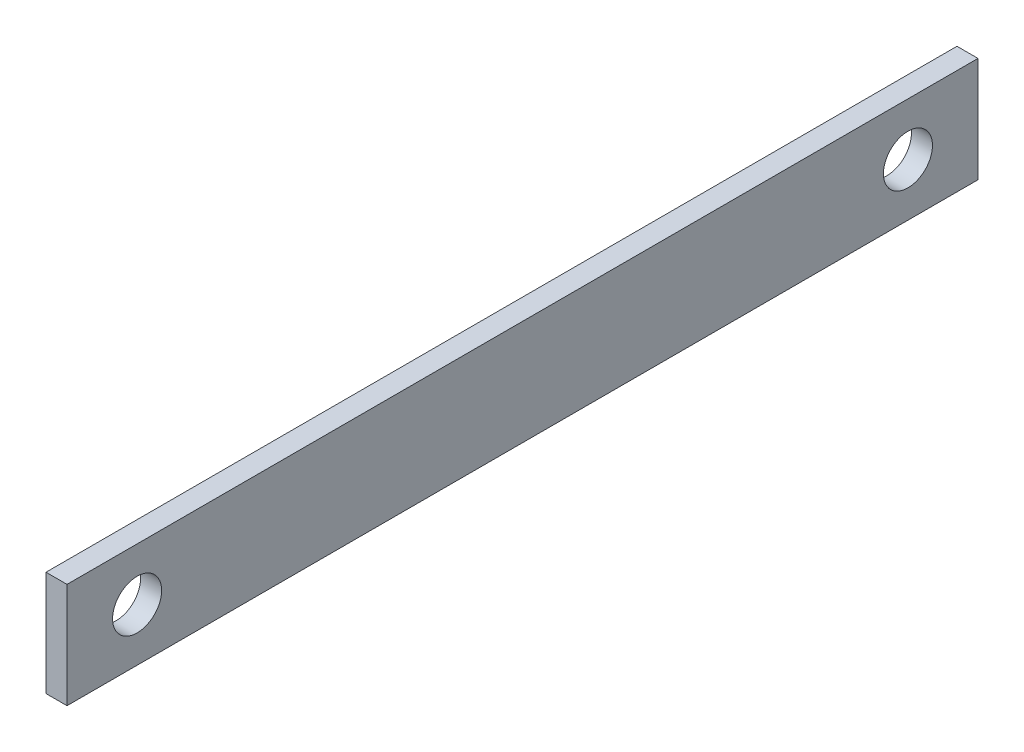
ISO-10303-21;
HEADER;
FILE_DESCRIPTION(('STEP AP214'),'2;1');
FILE_NAME('part.step','',(''),(''),'','','');
FILE_SCHEMA(('AUTOMOTIVE_DESIGN { 1 0 10303 214 1 1 1 1 }'));
ENDSEC;
DATA;
#1=APPLICATION_CONTEXT('core data for automotive mechanical design processes');
#2=APPLICATION_PROTOCOL_DEFINITION('international standard','automotive_design',2000,#1);
#3=PRODUCT_CONTEXT('',#1,'mechanical');
#4=PRODUCT('Part','Part','',(#3));
#5=PRODUCT_RELATED_PRODUCT_CATEGORY('part','',(#4));
#6=PRODUCT_DEFINITION_FORMATION('','',#4);
#7=PRODUCT_DEFINITION_CONTEXT('part definition',#1,'design');
#8=PRODUCT_DEFINITION('design','',#6,#7);
#9=PRODUCT_DEFINITION_SHAPE('','',#8);
#10=(LENGTH_UNIT() NAMED_UNIT(*) SI_UNIT(.MILLI.,.METRE.));
#11=(NAMED_UNIT(*) PLANE_ANGLE_UNIT() SI_UNIT($,.RADIAN.));
#12=(NAMED_UNIT(*) SI_UNIT($,.STERADIAN.) SOLID_ANGLE_UNIT());
#13=UNCERTAINTY_MEASURE_WITH_UNIT(LENGTH_MEASURE(1.E-05),#10,'distance_accuracy_value','');
#14=(GEOMETRIC_REPRESENTATION_CONTEXT(3) GLOBAL_UNCERTAINTY_ASSIGNED_CONTEXT((#13)) GLOBAL_UNIT_ASSIGNED_CONTEXT((#10,
#11,#12)) REPRESENTATION_CONTEXT('',''));
#15=CARTESIAN_POINT('',(0.,0.,0.));
#16=DIRECTION('',(0.,0.,1.));
#17=DIRECTION('',(1.,0.,0.));
#18=AXIS2_PLACEMENT_3D('',#15,#16,#17);
#19=CARTESIAN_POINT('',(6.,0.,0.));
#20=DIRECTION('',(-1.,0.,0.));
#21=DIRECTION('',(0.,0.,1.));
#22=AXIS2_PLACEMENT_3D('',#19,#20,#21);
#23=PLANE('',#22);
#24=DIRECTION('',(0.,1.,0.));
#25=VECTOR('',#24,1.);
#26=CARTESIAN_POINT('',(6.,-15.,-130.));
#27=LINE('',#26,#25);
#28=CARTESIAN_POINT('',(6.,-15.,-130.));
#29=VERTEX_POINT('',#28);
#30=CARTESIAN_POINT('',(6.,15.,-130.));
#31=VERTEX_POINT('',#30);
#32=EDGE_CURVE('E85',#29,#31,#27,.T.);
#33=ORIENTED_EDGE('',*,*,#32,.T.);
#34=DIRECTION('',(0.,0.,1.));
#35=VECTOR('',#34,1.);
#36=CARTESIAN_POINT('',(6.,15.,130.));
#37=LINE('',#36,#35);
#38=CARTESIAN_POINT('',(6.,15.,130.));
#39=VERTEX_POINT('',#38);
#40=EDGE_CURVE('E80',#31,#39,#37,.T.);
#41=ORIENTED_EDGE('',*,*,#40,.T.);
#42=DIRECTION('',(0.,-1.,0.));
#43=VECTOR('',#42,1.);
#44=CARTESIAN_POINT('',(6.,-15.,130.));
#45=LINE('',#44,#43);
#46=CARTESIAN_POINT('',(6.,-15.,130.));
#47=VERTEX_POINT('',#46);
#48=EDGE_CURVE('E83',#39,#47,#45,.T.);
#49=ORIENTED_EDGE('',*,*,#48,.T.);
#50=DIRECTION('',(0.,0.,-1.));
#51=VECTOR('',#50,1.);
#52=CARTESIAN_POINT('',(6.,-15.,130.));
#53=LINE('',#52,#51);
#54=EDGE_CURVE('E50',#47,#29,#53,.T.);
#55=ORIENTED_EDGE('',*,*,#54,.T.);
#56=EDGE_LOOP('',(#33,#41,#49,#55));
#57=FACE_BOUND('',#56,.T.);
#58=CARTESIAN_POINT('',(6.,0.,110.));
#59=DIRECTION('',(1.,0.,0.));
#60=DIRECTION('',(0.,0.,-1.));
#61=AXIS2_PLACEMENT_3D('',#58,#59,#60);
#62=CIRCLE('',#61,7.);
#63=CARTESIAN_POINT('',(6.,0.,103.));
#64=VERTEX_POINT('',#63);
#65=EDGE_CURVE('E100',#64,#64,#62,.T.);
#66=ORIENTED_EDGE('',*,*,#65,.F.);
#67=EDGE_LOOP('',(#66));
#68=FACE_BOUND('',#67,.T.);
#69=CARTESIAN_POINT('',(6.,0.,-110.));
#70=DIRECTION('',(1.,0.,0.));
#71=DIRECTION('',(0.,0.,-1.));
#72=AXIS2_PLACEMENT_3D('',#69,#70,#71);
#73=CIRCLE('',#72,7.);
#74=CARTESIAN_POINT('',(6.,0.,-117.));
#75=VERTEX_POINT('',#74);
#76=EDGE_CURVE('E115',#75,#75,#73,.T.);
#77=ORIENTED_EDGE('',*,*,#76,.F.);
#78=EDGE_LOOP('',(#77));
#79=FACE_BOUND('',#78,.T.);
#80=ADVANCED_FACE('F33',(#57,#68,#79),#23,.F.);
#81=CARTESIAN_POINT('',(0.,0.,0.));
#82=DIRECTION('',(-1.,0.,0.));
#83=DIRECTION('',(0.,0.,1.));
#84=AXIS2_PLACEMENT_3D('',#81,#82,#83);
#85=PLANE('',#84);
#86=CARTESIAN_POINT('',(0.,0.,110.));
#87=DIRECTION('',(1.,0.,0.));
#88=DIRECTION('',(0.,0.,-1.));
#89=AXIS2_PLACEMENT_3D('',#86,#87,#88);
#90=CIRCLE('',#89,7.);
#91=CARTESIAN_POINT('',(0.,0.,103.));
#92=VERTEX_POINT('',#91);
#93=EDGE_CURVE('E112',#92,#92,#90,.T.);
#94=ORIENTED_EDGE('',*,*,#93,.T.);
#95=EDGE_LOOP('',(#94));
#96=FACE_BOUND('',#95,.T.);
#97=DIRECTION('',(0.,1.,0.));
#98=VECTOR('',#97,1.);
#99=CARTESIAN_POINT('',(0.,-15.,-130.));
#100=LINE('',#99,#98);
#101=CARTESIAN_POINT('',(0.,-15.,-130.));
#102=VERTEX_POINT('',#101);
#103=CARTESIAN_POINT('',(0.,15.,-130.));
#104=VERTEX_POINT('',#103);
#105=EDGE_CURVE('E97',#102,#104,#100,.T.);
#106=ORIENTED_EDGE('',*,*,#105,.F.);
#107=DIRECTION('',(0.,0.,-1.));
#108=VECTOR('',#107,1.);
#109=CARTESIAN_POINT('',(0.,-15.,130.));
#110=LINE('',#109,#108);
#111=CARTESIAN_POINT('',(0.,-15.,130.));
#112=VERTEX_POINT('',#111);
#113=EDGE_CURVE('E73',#112,#102,#110,.T.);
#114=ORIENTED_EDGE('',*,*,#113,.F.);
#115=DIRECTION('',(0.,-1.,0.));
#116=VECTOR('',#115,1.);
#117=CARTESIAN_POINT('',(0.,-15.,130.));
#118=LINE('',#117,#116);
#119=CARTESIAN_POINT('',(0.,15.,130.));
#120=VERTEX_POINT('',#119);
#121=EDGE_CURVE('E67',#120,#112,#118,.T.);
#122=ORIENTED_EDGE('',*,*,#121,.F.);
#123=DIRECTION('',(0.,0.,1.));
#124=VECTOR('',#123,1.);
#125=CARTESIAN_POINT('',(0.,15.,130.));
#126=LINE('',#125,#124);
#127=EDGE_CURVE('E89',#104,#120,#126,.T.);
#128=ORIENTED_EDGE('',*,*,#127,.F.);
#129=EDGE_LOOP('',(#106,#114,#122,#128));
#130=FACE_BOUND('',#129,.T.);
#131=CARTESIAN_POINT('',(0.,0.,-110.));
#132=DIRECTION('',(1.,0.,0.));
#133=DIRECTION('',(0.,0.,-1.));
#134=AXIS2_PLACEMENT_3D('',#131,#132,#133);
#135=CIRCLE('',#134,7.);
#136=CARTESIAN_POINT('',(0.,0.,-117.));
#137=VERTEX_POINT('',#136);
#138=EDGE_CURVE('E118',#137,#137,#135,.T.);
#139=ORIENTED_EDGE('',*,*,#138,.T.);
#140=EDGE_LOOP('',(#139));
#141=FACE_BOUND('',#140,.T.);
#142=ADVANCED_FACE('F108',(#96,#130,#141),#85,.T.);
#143=CARTESIAN_POINT('',(6.,-15.,-130.));
#144=DIRECTION('',(0.,0.,1.));
#145=DIRECTION('',(1.,0.,0.));
#146=AXIS2_PLACEMENT_3D('',#143,#144,#145);
#147=PLANE('',#146);
#148=ORIENTED_EDGE('',*,*,#105,.T.);
#149=DIRECTION('',(-1.,0.,0.));
#150=VECTOR('',#149,1.);
#151=CARTESIAN_POINT('',(6.,15.,-130.));
#152=LINE('',#151,#150);
#153=EDGE_CURVE('E11',#31,#104,#152,.T.);
#154=ORIENTED_EDGE('',*,*,#153,.F.);
#155=ORIENTED_EDGE('',*,*,#32,.F.);
#156=DIRECTION('',(-1.,0.,0.));
#157=VECTOR('',#156,1.);
#158=CARTESIAN_POINT('',(6.,-15.,-130.));
#159=LINE('',#158,#157);
#160=EDGE_CURVE('E93',#29,#102,#159,.T.);
#161=ORIENTED_EDGE('',*,*,#160,.T.);
#162=EDGE_LOOP('',(#148,#154,#155,#161));
#163=FACE_BOUND('',#162,.T.);
#164=ADVANCED_FACE('F35',(#163),#147,.F.);
#165=CARTESIAN_POINT('',(6.,15.,130.));
#166=DIRECTION('',(0.,-1.,0.));
#167=DIRECTION('',(0.,0.,-1.));
#168=AXIS2_PLACEMENT_3D('',#165,#166,#167);
#169=PLANE('',#168);
#170=ORIENTED_EDGE('',*,*,#127,.T.);
#171=DIRECTION('',(-1.,0.,0.));
#172=VECTOR('',#171,1.);
#173=CARTESIAN_POINT('',(6.,15.,130.));
#174=LINE('',#173,#172);
#175=EDGE_CURVE('E42',#39,#120,#174,.T.);
#176=ORIENTED_EDGE('',*,*,#175,.F.);
#177=ORIENTED_EDGE('',*,*,#40,.F.);
#178=ORIENTED_EDGE('',*,*,#153,.T.);
#179=EDGE_LOOP('',(#170,#176,#177,#178));
#180=FACE_BOUND('',#179,.T.);
#181=ADVANCED_FACE('F88',(#180),#169,.F.);
#182=CARTESIAN_POINT('',(6.,-15.,130.));
#183=DIRECTION('',(0.,0.,-1.));
#184=DIRECTION('',(-1.,0.,0.));
#185=AXIS2_PLACEMENT_3D('',#182,#183,#184);
#186=PLANE('',#185);
#187=ORIENTED_EDGE('',*,*,#121,.T.);
#188=DIRECTION('',(-1.,0.,0.));
#189=VECTOR('',#188,1.);
#190=CARTESIAN_POINT('',(6.,-15.,130.));
#191=LINE('',#190,#189);
#192=EDGE_CURVE('E90',#47,#112,#191,.T.);
#193=ORIENTED_EDGE('',*,*,#192,.F.);
#194=ORIENTED_EDGE('',*,*,#48,.F.);
#195=ORIENTED_EDGE('',*,*,#175,.T.);
#196=EDGE_LOOP('',(#187,#193,#194,#195));
#197=FACE_BOUND('',#196,.T.);
#198=ADVANCED_FACE('F91',(#197),#186,.F.);
#199=CARTESIAN_POINT('',(6.,-15.,130.));
#200=DIRECTION('',(0.,1.,0.));
#201=DIRECTION('',(0.,0.,1.));
#202=AXIS2_PLACEMENT_3D('',#199,#200,#201);
#203=PLANE('',#202);
#204=ORIENTED_EDGE('',*,*,#113,.T.);
#205=ORIENTED_EDGE('',*,*,#160,.F.);
#206=ORIENTED_EDGE('',*,*,#54,.F.);
#207=ORIENTED_EDGE('',*,*,#192,.T.);
#208=EDGE_LOOP('',(#204,#205,#206,#207));
#209=FACE_BOUND('',#208,.T.);
#210=ADVANCED_FACE('F105',(#209),#203,.F.);
#211=CARTESIAN_POINT('',(6.,0.,110.));
#212=DIRECTION('',(-1.,0.,0.));
#213=DIRECTION('',(0.,0.,1.));
#214=AXIS2_PLACEMENT_3D('',#211,#212,#213);
#215=CYLINDRICAL_SURFACE('',#214,7.);
#216=ORIENTED_EDGE('',*,*,#65,.T.);
#217=EDGE_LOOP('',(#216));
#218=FACE_BOUND('',#217,.T.);
#219=ORIENTED_EDGE('',*,*,#93,.F.);
#220=EDGE_LOOP('',(#219));
#221=FACE_BOUND('',#220,.T.);
#222=ADVANCED_FACE('F135',(#218,#221),#215,.F.);
#223=CARTESIAN_POINT('',(6.,0.,-110.));
#224=DIRECTION('',(-1.,0.,0.));
#225=DIRECTION('',(0.,0.,1.));
#226=AXIS2_PLACEMENT_3D('',#223,#224,#225);
#227=CYLINDRICAL_SURFACE('',#226,7.);
#228=ORIENTED_EDGE('',*,*,#76,.T.);
#229=EDGE_LOOP('',(#228));
#230=FACE_BOUND('',#229,.T.);
#231=ORIENTED_EDGE('',*,*,#138,.F.);
#232=EDGE_LOOP('',(#231));
#233=FACE_BOUND('',#232,.T.);
#234=ADVANCED_FACE('F124',(#230,#233),#227,.F.);
#235=CLOSED_SHELL('',(#80,#142,#164,#181,#198,#210,#222,#234));
#236=MANIFOLD_SOLID_BREP('B2',#235);
#237=ADVANCED_BREP_SHAPE_REPRESENTATION('',(#18,#236),#14);
#238=SHAPE_DEFINITION_REPRESENTATION(#9,#237);
ENDSEC;
END-ISO-10303-21;
